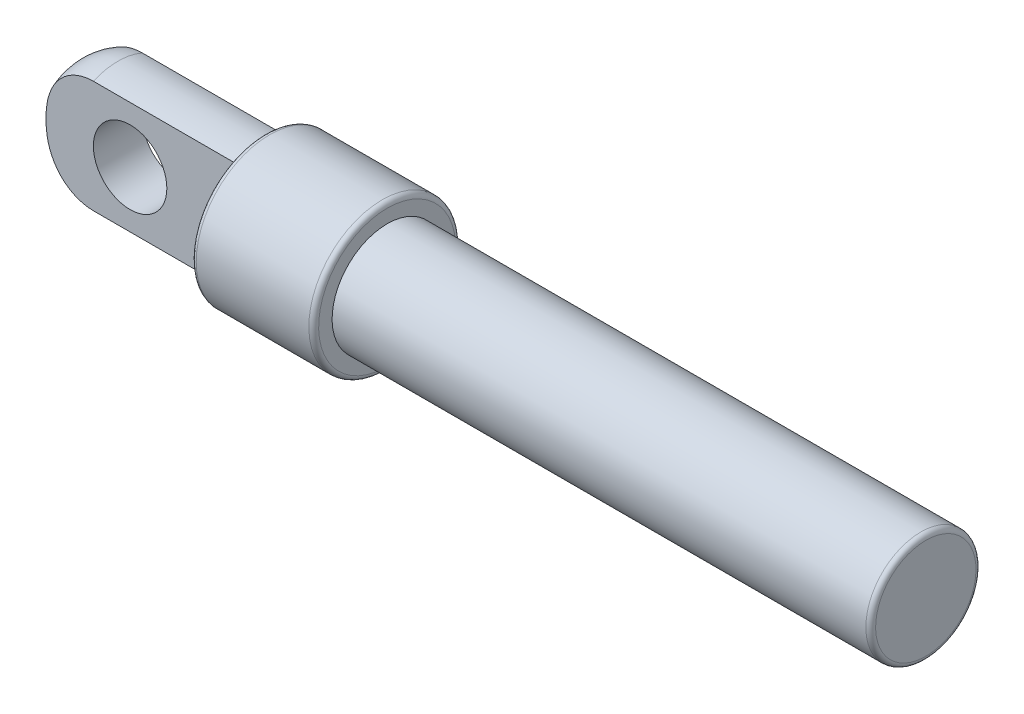
ISO-10303-21;
HEADER;
FILE_DESCRIPTION(('STEP AP214'),'2;1');
FILE_NAME('part.step','',(''),(''),'','','');
FILE_SCHEMA(('AUTOMOTIVE_DESIGN { 1 0 10303 214 1 1 1 1 }'));
ENDSEC;
DATA;
#1=APPLICATION_CONTEXT('core data for automotive mechanical design processes');
#2=APPLICATION_PROTOCOL_DEFINITION('international standard','automotive_design',2000,#1);
#3=PRODUCT_CONTEXT('',#1,'mechanical');
#4=PRODUCT('Part','Part','',(#3));
#5=PRODUCT_RELATED_PRODUCT_CATEGORY('part','',(#4));
#6=PRODUCT_DEFINITION_FORMATION('','',#4);
#7=PRODUCT_DEFINITION_CONTEXT('part definition',#1,'design');
#8=PRODUCT_DEFINITION('design','',#6,#7);
#9=PRODUCT_DEFINITION_SHAPE('','',#8);
#10=(LENGTH_UNIT() NAMED_UNIT(*) SI_UNIT(.MILLI.,.METRE.));
#11=(NAMED_UNIT(*) PLANE_ANGLE_UNIT() SI_UNIT($,.RADIAN.));
#12=(NAMED_UNIT(*) SI_UNIT($,.STERADIAN.) SOLID_ANGLE_UNIT());
#13=UNCERTAINTY_MEASURE_WITH_UNIT(LENGTH_MEASURE(1.E-05),#10,'distance_accuracy_value','');
#14=(GEOMETRIC_REPRESENTATION_CONTEXT(3) GLOBAL_UNCERTAINTY_ASSIGNED_CONTEXT((#13)) GLOBAL_UNIT_ASSIGNED_CONTEXT((#10,
#11,#12)) REPRESENTATION_CONTEXT('',''));
#15=CARTESIAN_POINT('',(0.,0.,0.));
#16=DIRECTION('',(0.,0.,1.));
#17=DIRECTION('',(1.,0.,0.));
#18=AXIS2_PLACEMENT_3D('',#15,#16,#17);
#19=CARTESIAN_POINT('',(0.,0.,0.));
#20=DIRECTION('',(1.,0.,0.));
#21=DIRECTION('',(0.,1.,0.));
#22=AXIS2_PLACEMENT_3D('',#19,#20,#21);
#23=CYLINDRICAL_SURFACE('',#22,2.5);
#24=CARTESIAN_POINT('',(-27.,0.,0.));
#25=DIRECTION('',(1.,0.,0.));
#26=DIRECTION('',(0.,1.,0.));
#27=AXIS2_PLACEMENT_3D('',#24,#25,#26);
#28=CIRCLE('',#27,2.5);
#29=CARTESIAN_POINT('',(-27.,2.29128784747792,-1.));
#30=VERTEX_POINT('',#29);
#31=CARTESIAN_POINT('',(-27.,2.29128784747792,1.));
#32=VERTEX_POINT('',#31);
#33=EDGE_CURVE('E87',#30,#32,#28,.T.);
#34=ORIENTED_EDGE('',*,*,#33,.F.);
#35=DIRECTION('',(1.,0.,0.));
#36=VECTOR('',#35,1.);
#37=CARTESIAN_POINT('',(0.,2.29128784747792,-1.));
#38=LINE('',#37,#36);
#39=CARTESIAN_POINT('',(-33.,2.29128784747792,-1.));
#40=VERTEX_POINT('',#39);
#41=EDGE_CURVE('E96',#30,#40,#38,.F.);
#42=ORIENTED_EDGE('',*,*,#41,.T.);
#43=CARTESIAN_POINT('',(-33.,0.,0.));
#44=DIRECTION('',(-1.,0.,0.));
#45=DIRECTION('',(0.,-1.,0.));
#46=AXIS2_PLACEMENT_3D('',#43,#44,#45);
#47=CIRCLE('',#46,2.5);
#48=CARTESIAN_POINT('',(-33.,2.29128784747792,1.));
#49=VERTEX_POINT('',#48);
#50=EDGE_CURVE('E101',#40,#49,#47,.F.);
#51=ORIENTED_EDGE('',*,*,#50,.T.);
#52=DIRECTION('',(1.,0.,0.));
#53=VECTOR('',#52,1.);
#54=CARTESIAN_POINT('',(0.,2.29128784747792,1.));
#55=LINE('',#54,#53);
#56=EDGE_CURVE('E46',#49,#32,#55,.T.);
#57=ORIENTED_EDGE('',*,*,#56,.T.);
#58=EDGE_LOOP('',(#34,#42,#51,#57));
#59=FACE_BOUND('',#58,.T.);
#60=ADVANCED_FACE('F31',(#59),#23,.T.);
#61=CARTESIAN_POINT('',(-33.,-2.29128784747792,0.999999999999999));
#62=VERTEX_POINT('',#61);
#63=CARTESIAN_POINT('',(-33.,-2.29128784747793,-0.999999999999999));
#64=VERTEX_POINT('',#63);
#65=EDGE_CURVE('E94',#62,#64,#47,.F.);
#66=ORIENTED_EDGE('',*,*,#65,.T.);
#67=DIRECTION('',(1.,0.,0.));
#68=VECTOR('',#67,1.);
#69=CARTESIAN_POINT('',(0.,-2.29128784747792,-0.999999999999999));
#70=LINE('',#69,#68);
#71=CARTESIAN_POINT('',(-27.,-2.29128784747792,-0.999999999999999));
#72=VERTEX_POINT('',#71);
#73=EDGE_CURVE('E54',#64,#72,#70,.T.);
#74=ORIENTED_EDGE('',*,*,#73,.T.);
#75=CARTESIAN_POINT('',(-27.,-2.29128784747792,0.999999999999999));
#76=VERTEX_POINT('',#75);
#77=EDGE_CURVE('E85',#76,#72,#28,.T.);
#78=ORIENTED_EDGE('',*,*,#77,.F.);
#79=DIRECTION('',(1.,0.,0.));
#80=VECTOR('',#79,1.);
#81=CARTESIAN_POINT('',(0.,-2.29128784747792,0.999999999999999));
#82=LINE('',#81,#80);
#83=EDGE_CURVE('E70',#76,#62,#82,.F.);
#84=ORIENTED_EDGE('',*,*,#83,.T.);
#85=EDGE_LOOP('',(#66,#74,#78,#84));
#86=FACE_BOUND('',#85,.T.);
#87=ADVANCED_FACE('F90',(#86),#23,.T.);
#88=CARTESIAN_POINT('',(-33.,0.,0.));
#89=DIRECTION('',(-1.,0.,0.));
#90=DIRECTION('',(0.,-1.,0.));
#91=AXIS2_PLACEMENT_3D('',#88,#89,#90);
#92=DEGENERATE_TOROIDAL_SURFACE('',#91,0.5,2.,.T.);
#93=CARTESIAN_POINT('',(-35.,0.,0.));
#94=DIRECTION('',(-1.,0.,0.));
#95=DIRECTION('',(0.,-1.,0.));
#96=AXIS2_PLACEMENT_3D('',#93,#94,#95);
#97=CIRCLE('',#96,0.5);
#98=CARTESIAN_POINT('',(-35.,-0.500000000000005,0.));
#99=VERTEX_POINT('',#98);
#100=EDGE_CURVE('E102',#99,#99,#97,.T.);
#101=ORIENTED_EDGE('',*,*,#100,.F.);
#102=EDGE_LOOP('',(#101));
#103=FACE_BOUND('',#102,.T.);
#104=ORIENTED_EDGE('',*,*,#50,.F.);
#105=CARTESIAN_POINT('',(-34.9364916731037,0.,-0.999999999999999));
#106=CARTESIAN_POINT('',(-34.9364968852338,-0.0864388218286752,-0.999999999999999));
#107=CARTESIAN_POINT('',(-34.9336508411077,-0.172885243617852,-0.999999999999999));
#108=CARTESIAN_POINT('',(-34.9216730589692,-0.345373113218984,-0.999999999999999));
#109=CARTESIAN_POINT('',(-34.9125406464644,-0.431414516577213,-0.999999999999999));
#110=CARTESIAN_POINT('',(-34.8867385471035,-0.601958148981141,-0.999999999999999));
#111=CARTESIAN_POINT('',(-34.8701076685781,-0.686466001184827,-0.999999999999999));
#112=CARTESIAN_POINT('',(-34.8281780650929,-0.853258846612277,-0.999999999999999));
#113=CARTESIAN_POINT('',(-34.8028862126831,-0.935545546654914,-0.999999999999999));
#114=CARTESIAN_POINT('',(-34.7336554935459,-1.12154296735965,-0.999999999999999));
#115=CARTESIAN_POINT('',(-34.6863725928593,-1.22404586072643,-0.999999999999999));
#116=CARTESIAN_POINT('',(-34.575486457546,-1.41995287957879,-0.999999999999999));
#117=CARTESIAN_POINT('',(-34.5118727611954,-1.51335111938769,-0.999999999999999));
#118=CARTESIAN_POINT('',(-34.3691957111788,-1.6880578175742,-0.999999999999999));
#119=CARTESIAN_POINT('',(-34.2900830598952,-1.76932620182769,-0.999999999999999));
#120=CARTESIAN_POINT('',(-34.1186240688956,-1.91646166331306,-0.999999999999999));
#121=CARTESIAN_POINT('',(-34.026279953278,-1.98233132405443,-0.999999999999999));
#122=CARTESIAN_POINT('',(-33.8365361301393,-2.09314262545748,-0.999999999999999));
#123=CARTESIAN_POINT('',(-33.7396885305735,-2.13903127530775,-0.999999999999999));
#124=CARTESIAN_POINT('',(-33.5395264931629,-2.21337947706467,-0.999999999999999));
#125=CARTESIAN_POINT('',(-33.4362134862595,-2.24184287064474,-0.999999999999999));
#126=CARTESIAN_POINT('',(-33.2290766002669,-2.27987921301313,-0.999999999999999));
#127=CARTESIAN_POINT('',(-33.1253427365699,-2.28994403049808,-0.999999999999999));
#128=CARTESIAN_POINT('',(-32.9176660105233,-2.29237937575555,-0.999999999999999));
#129=CARTESIAN_POINT('',(-32.8137231539911,-2.28475038940861,-0.999999999999999));
#130=CARTESIAN_POINT('',(-32.6093527936423,-2.2521551247641,-0.999999999999999));
#131=CARTESIAN_POINT('',(-32.5089056255521,-2.22731185621842,-0.999999999999999));
#132=CARTESIAN_POINT('',(-32.3135935266958,-2.16119713484256,-0.999999999999999));
#133=CARTESIAN_POINT('',(-32.2187278042196,-2.11992801844631,-0.999999999999999));
#134=CARTESIAN_POINT('',(-32.0367174134781,-2.02199962189955,-0.999999999999999));
#135=CARTESIAN_POINT('',(-31.9496124286416,-1.96526666181699,-0.999999999999999));
#136=CARTESIAN_POINT('',(-31.7858910412443,-1.8382337650407,-0.999999999999999));
#137=CARTESIAN_POINT('',(-31.7092795997144,-1.76792744885991,-0.999999999999999));
#138=CARTESIAN_POINT('',(-31.5668777112779,-1.61426814164631,-0.999999999999999));
#139=CARTESIAN_POINT('',(-31.5013553047682,-1.53066716368665,-0.999999999999999));
#140=CARTESIAN_POINT('',(-31.3845111827147,-1.35429350972309,-0.999999999999999));
#141=CARTESIAN_POINT('',(-31.3331706769844,-1.26153319279847,-0.999999999999999));
#142=CARTESIAN_POINT('',(-31.2423494945351,-1.06380569037484,-0.999999999999999));
#143=CARTESIAN_POINT('',(-31.2037344100404,-0.958442152817419,-0.999999999999999));
#144=CARTESIAN_POINT('',(-31.1571781570387,-0.797066595483357,-0.999999999999999));
#145=CARTESIAN_POINT('',(-31.1435373991847,-0.742603281261979,-0.999999999999999));
#146=CARTESIAN_POINT('',(-31.1197963740074,-0.632905260704804,-0.999999999999999));
#147=CARTESIAN_POINT('',(-31.1096962986549,-0.577670512711706,-0.999999999999999));
#148=CARTESIAN_POINT('',(-31.0861217907918,-0.423770035022283,-0.999999999999999));
#149=CARTESIAN_POINT('',(-31.0760841446268,-0.324571078041406,-0.999999999999999));
#150=CARTESIAN_POINT('',(-31.0671739958668,-0.17541607996462,-0.999999999999999));
#151=CARTESIAN_POINT('',(-31.0652292021336,-0.125600131528569,-0.999999999999999));
#152=CARTESIAN_POINT('',(-31.0632719423356,-0.0259266605596096,-0.999999999999999));
#153=CARTESIAN_POINT('',(-31.0632593969476,0.0239308601826358,-0.999999999999999));
#154=CARTESIAN_POINT('',(-31.0651637573037,0.123568152603971,-0.999999999999999));
#155=CARTESIAN_POINT('',(-31.0670790338137,0.173347954385343,-0.999999999999999));
#156=CARTESIAN_POINT('',(-31.0729631654939,0.272785837877402,-0.999999999999999));
#157=CARTESIAN_POINT('',(-31.07693224011,0.322443906011211,-0.999999999999999));
#158=CARTESIAN_POINT('',(-31.0922413160979,0.470945840551915,-0.999999999999999));
#159=CARTESIAN_POINT('',(-31.1069851136435,0.569492965794004,-0.999999999999999));
#160=CARTESIAN_POINT('',(-31.1394997491128,0.725846049388304,-0.999999999999999));
#161=CARTESIAN_POINT('',(-31.153781731779,0.784387214364913,-0.999999999999999));
#162=CARTESIAN_POINT('',(-31.1867198047101,0.900242013623902,-0.999999999999999));
#163=CARTESIAN_POINT('',(-31.205375994409,0.957555619969231,-0.999999999999999));
#164=CARTESIAN_POINT('',(-31.2472174326082,1.07033514303808,-0.999999999999999));
#165=CARTESIAN_POINT('',(-31.2703898556246,1.12580578324702,-0.999999999999999));
#166=CARTESIAN_POINT('',(-31.3213669072587,1.23457989257109,-0.999999999999999));
#167=CARTESIAN_POINT('',(-31.349172804357,1.28788276324306,-0.999999999999999));
#168=CARTESIAN_POINT('',(-31.4399710243922,1.44453212847917,-0.999999999999999));
#169=CARTESIAN_POINT('',(-31.5100817128507,1.54389716469059,-0.999999999999999));
#170=CARTESIAN_POINT('',(-31.6677283124245,1.72788292215399,-0.999999999999999));
#171=CARTESIAN_POINT('',(-31.7552840021361,1.8124867014528,-0.999999999999999));
#172=CARTESIAN_POINT('',(-31.9359159469969,1.95612504152074,-0.999999999999999));
#173=CARTESIAN_POINT('',(-32.0276661538203,2.01682998385321,-1.));
#174=CARTESIAN_POINT('',(-32.2203720744706,2.12110029618652,-1.));
#175=CARTESIAN_POINT('',(-32.3213204024383,2.16467927108066,-1.));
#176=CARTESIAN_POINT('',(-32.5247062401465,2.23170899244727,-1.));
#177=CARTESIAN_POINT('',(-32.6268780947665,2.25596834614888,-1.));
#178=CARTESIAN_POINT('',(-32.8338719061735,2.28673772584853,-1.));
#179=CARTESIAN_POINT('',(-32.9386939101885,2.29324743530671,-1.));
#180=CARTESIAN_POINT('',(-33.1465088529826,2.28833829160632,-1.));
#181=CARTESIAN_POINT('',(-33.2495075227132,2.27715772394052,-1.));
#182=CARTESIAN_POINT('',(-33.4521566843987,2.23766480667797,-1.));
#183=CARTESIAN_POINT('',(-33.5518074290321,2.20935375305316,-1.));
#184=CARTESIAN_POINT('',(-33.7450007648209,2.13647083978637,-1.));
#185=CARTESIAN_POINT('',(-33.8385415126327,2.09189409937022,-0.999999999999999));
#186=CARTESIAN_POINT('',(-34.0169401464301,1.98786230607881,-0.999999999999999));
#187=CARTESIAN_POINT('',(-34.101797497825,1.92840633794365,-0.999999999999999));
#188=CARTESIAN_POINT('',(-34.2617187190869,1.79555320930827,-0.999999999999999));
#189=CARTESIAN_POINT('',(-34.3366357572135,1.72197954236864,-0.999999999999999));
#190=CARTESIAN_POINT('',(-34.4735725647619,1.56371487942677,-0.999999999999999));
#191=CARTESIAN_POINT('',(-34.5355923454226,1.47902389311247,-0.999999999999999));
#192=CARTESIAN_POINT('',(-34.6478643283935,1.29756162306096,-0.999999999999999));
#193=CARTESIAN_POINT('',(-34.6975575098147,1.20044613856425,-0.999999999999999));
#194=CARTESIAN_POINT('',(-34.7817127912752,0.999932461553226,-0.999999999999999));
#195=CARTESIAN_POINT('',(-34.816180247701,0.896536493087977,-0.999999999999999));
#196=CARTESIAN_POINT('',(-34.860409647958,0.727105785540783,-0.999999999999999));
#197=CARTESIAN_POINT('',(-34.8745675671338,0.662159208612286,-0.999999999999999));
#198=CARTESIAN_POINT('',(-34.8981712395961,0.531403966585108,-0.999999999999999));
#199=CARTESIAN_POINT('',(-34.9076160789197,0.465595136815183,-0.999999999999999));
#200=CARTESIAN_POINT('',(-34.9224122632784,0.333254708198169,-0.999999999999999));
#201=CARTESIAN_POINT('',(-34.9277462307139,0.266721233843884,-0.999999999999999));
#202=CARTESIAN_POINT('',(-34.9347842452125,0.133460037756156,-0.999999999999999));
#203=CARTESIAN_POINT('',(-34.936487649248,0.0667322837082231,-0.999999999999999));
#204=CARTESIAN_POINT('',(-34.9364916731037,0.,-0.999999999999999));
#205=B_SPLINE_CURVE_WITH_KNOTS('',3,(#105,#106,#107,#108,#109,#110,#111,#112,#113,#114,#115,
#116,#117,#118,#119,#120,#121,#122,#123,#124,#125,#126,#127,#128,#129,#130,#131,#132,#133,#134,
#135,#136,#137,#138,#139,#140,#141,#142,#143,#144,#145,#146,#147,#148,#149,#150,#151,#152,#153,
#154,#155,#156,#157,#158,#159,#160,#161,#162,#163,#164,#165,#166,#167,#168,#169,#170,#171,#172,
#173,#174,#175,#176,#177,#178,#179,#180,#181,#182,#183,#184,#185,#186,#187,#188,#189,#190,#191,
#192,#193,#194,#195,#196,#197,#198,#199,#200,#201,#202,#203,#204),.UNSPECIFIED.,.T.,.F.,(4,2,2,
2,2,2,2,2,2,2,2,2,2,2,2,2,2,2,2,2,2,2,2,2,2,2,2,2,2,2,2,2,2,2,2,2,2,2,2,2,2,2,2,2,2,2,2,2,2,4),
(0.,0.259274933937938,0.518577690974417,0.776553562582868,1.03432520086806,1.3714938519556,
1.7088790390928,2.04735530179383,2.38577473606898,2.70569903793162,3.02555278199602,
3.33672297400177,3.64788462122253,3.95684539664001,4.26576224077239,4.57617750451679,
4.88673902040676,5.20397706706405,5.52079275354719,5.8560728197869,6.02441247245902,
6.19276125086521,6.49138212898077,6.64092119483676,6.79045412178008,6.93986078198001,
7.08928340939348,7.38760364150585,7.56823436609465,7.74886919715895,7.92899833432591,
8.10917686570964,8.47180749653331,8.83485163041563,9.16322007919573,9.4913271417323,
9.80484962483818,10.1183776991386,10.4277184190889,10.737035739424,11.0464459516959,
11.3558752012726,11.6694600855627,11.9830446965881,12.3089676162012,12.634775785142,
12.8340286071411,13.0333200533483,13.2334493984104,13.4336141864529),.UNSPECIFIED.);
#206=EDGE_CURVE('E110',#40,#64,#205,.T.);
#207=ORIENTED_EDGE('',*,*,#206,.T.);
#208=ORIENTED_EDGE('',*,*,#65,.F.);
#209=CARTESIAN_POINT('',(-34.9364916731037,0.,0.999999999999999));
#210=CARTESIAN_POINT('',(-34.9364968852338,0.0864388218286675,0.999999999999999));
#211=CARTESIAN_POINT('',(-34.9336508411077,0.172885243617845,0.999999999999999));
#212=CARTESIAN_POINT('',(-34.9216730589692,0.345373113218976,0.999999999999999));
#213=CARTESIAN_POINT('',(-34.9125406464644,0.431414516577206,0.999999999999999));
#214=CARTESIAN_POINT('',(-34.8867385471035,0.601958148981133,0.999999999999999));
#215=CARTESIAN_POINT('',(-34.8701076685781,0.686466001184819,0.999999999999999));
#216=CARTESIAN_POINT('',(-34.8281780650929,0.853258846612269,0.999999999999999));
#217=CARTESIAN_POINT('',(-34.8028862126831,0.935545546654906,0.999999999999999));
#218=CARTESIAN_POINT('',(-34.7336554935459,1.12154296735964,0.999999999999999));
#219=CARTESIAN_POINT('',(-34.6863725928593,1.22404586072643,0.999999999999999));
#220=CARTESIAN_POINT('',(-34.575486457546,1.41995287957878,0.999999999999999));
#221=CARTESIAN_POINT('',(-34.5118727611954,1.51335111938768,0.999999999999999));
#222=CARTESIAN_POINT('',(-34.3691957111788,1.68805781757419,0.999999999999999));
#223=CARTESIAN_POINT('',(-34.2900830598952,1.76932620182768,0.999999999999999));
#224=CARTESIAN_POINT('',(-34.1186240688956,1.91646166331305,0.999999999999999));
#225=CARTESIAN_POINT('',(-34.026279953278,1.98233132405443,0.999999999999999));
#226=CARTESIAN_POINT('',(-33.8365361301393,2.09314262545747,0.999999999999999));
#227=CARTESIAN_POINT('',(-33.7396885305735,2.13903127530775,1.));
#228=CARTESIAN_POINT('',(-33.5395264931629,2.21337947706466,1.));
#229=CARTESIAN_POINT('',(-33.4362134862595,2.24184287064473,1.));
#230=CARTESIAN_POINT('',(-33.2290766002669,2.27987921301313,1.));
#231=CARTESIAN_POINT('',(-33.1253427365699,2.28994403049807,1.));
#232=CARTESIAN_POINT('',(-32.9176660105233,2.29237937575554,1.));
#233=CARTESIAN_POINT('',(-32.8137231539911,2.28475038940861,1.));
#234=CARTESIAN_POINT('',(-32.6093527936423,2.25215512476409,1.));
#235=CARTESIAN_POINT('',(-32.5089056255521,2.22731185621841,1.));
#236=CARTESIAN_POINT('',(-32.3135935266958,2.16119713484255,1.));
#237=CARTESIAN_POINT('',(-32.2187278042196,2.1199280184463,1.));
#238=CARTESIAN_POINT('',(-32.0367174134781,2.02199962189954,1.));
#239=CARTESIAN_POINT('',(-31.9496124286416,1.96526666181698,0.999999999999999));
#240=CARTESIAN_POINT('',(-31.7858910412443,1.83823376504069,0.999999999999999));
#241=CARTESIAN_POINT('',(-31.7092795997144,1.7679274488599,0.999999999999999));
#242=CARTESIAN_POINT('',(-31.5668777112779,1.6142681416463,0.999999999999999));
#243=CARTESIAN_POINT('',(-31.5013553047682,1.53066716368664,0.999999999999999));
#244=CARTESIAN_POINT('',(-31.3845111827147,1.35429350972308,0.999999999999999));
#245=CARTESIAN_POINT('',(-31.3331706769844,1.26153319279846,0.999999999999999));
#246=CARTESIAN_POINT('',(-31.2423494945351,1.06380569037483,0.999999999999999));
#247=CARTESIAN_POINT('',(-31.2037344100404,0.95844215281741,0.999999999999999));
#248=CARTESIAN_POINT('',(-31.1571781570387,0.797066595483348,0.999999999999999));
#249=CARTESIAN_POINT('',(-31.1435373991847,0.74260328126197,0.999999999999999));
#250=CARTESIAN_POINT('',(-31.1197963740074,0.632905260704795,0.999999999999999));
#251=CARTESIAN_POINT('',(-31.1096962986549,0.577670512711697,0.999999999999999));
#252=CARTESIAN_POINT('',(-31.0861217907918,0.423770035022274,0.999999999999999));
#253=CARTESIAN_POINT('',(-31.0760841446268,0.324571078041397,0.999999999999999));
#254=CARTESIAN_POINT('',(-31.0671739958668,0.17541607996461,0.999999999999999));
#255=CARTESIAN_POINT('',(-31.0652292021336,0.125600131528559,0.999999999999999));
#256=CARTESIAN_POINT('',(-31.0632719423356,0.0259266605595997,0.999999999999999));
#257=CARTESIAN_POINT('',(-31.0632593969476,-0.0239308601826454,0.999999999999999));
#258=CARTESIAN_POINT('',(-31.0651637573037,-0.123568152603981,0.999999999999999));
#259=CARTESIAN_POINT('',(-31.0670790338137,-0.173347954385352,0.999999999999999));
#260=CARTESIAN_POINT('',(-31.0729631654939,-0.272785837877411,0.999999999999999));
#261=CARTESIAN_POINT('',(-31.07693224011,-0.32244390601122,0.999999999999999));
#262=CARTESIAN_POINT('',(-31.0922413160979,-0.470945840551925,0.999999999999999));
#263=CARTESIAN_POINT('',(-31.1069851136435,-0.569492965794014,0.999999999999999));
#264=CARTESIAN_POINT('',(-31.1394997491128,-0.725846049388315,0.999999999999999));
#265=CARTESIAN_POINT('',(-31.153781731779,-0.784387214364923,0.999999999999999));
#266=CARTESIAN_POINT('',(-31.1867198047101,-0.900242013623913,0.999999999999999));
#267=CARTESIAN_POINT('',(-31.205375994409,-0.957555619969242,0.999999999999999));
#268=CARTESIAN_POINT('',(-31.2472174326082,-1.07033514303809,0.999999999999999));
#269=CARTESIAN_POINT('',(-31.2703898556246,-1.12580578324703,0.999999999999999));
#270=CARTESIAN_POINT('',(-31.3213669072587,-1.2345798925711,0.999999999999999));
#271=CARTESIAN_POINT('',(-31.349172804357,-1.28788276324307,0.999999999999999));
#272=CARTESIAN_POINT('',(-31.4399710243922,-1.44453212847919,0.999999999999999));
#273=CARTESIAN_POINT('',(-31.5100817128507,-1.54389716469061,0.999999999999999));
#274=CARTESIAN_POINT('',(-31.6677283124245,-1.727882922154,0.999999999999999));
#275=CARTESIAN_POINT('',(-31.7552840021361,-1.81248670145281,0.999999999999999));
#276=CARTESIAN_POINT('',(-31.9359159469969,-1.95612504152075,0.999999999999999));
#277=CARTESIAN_POINT('',(-32.0276661538203,-2.01682998385322,0.999999999999999));
#278=CARTESIAN_POINT('',(-32.2203720744706,-2.12110029618653,0.999999999999999));
#279=CARTESIAN_POINT('',(-32.3213204024383,-2.16467927108067,0.999999999999999));
#280=CARTESIAN_POINT('',(-32.5247062401465,-2.23170899244727,0.999999999999999));
#281=CARTESIAN_POINT('',(-32.6268780947665,-2.25596834614889,0.999999999999999));
#282=CARTESIAN_POINT('',(-32.8338719061735,-2.28673772584854,0.999999999999999));
#283=CARTESIAN_POINT('',(-32.9386939101885,-2.29324743530672,0.999999999999999));
#284=CARTESIAN_POINT('',(-33.1465088529826,-2.28833829160633,0.999999999999999));
#285=CARTESIAN_POINT('',(-33.2495075227132,-2.27715772394053,0.999999999999999));
#286=CARTESIAN_POINT('',(-33.4521566843987,-2.23766480667798,0.999999999999999));
#287=CARTESIAN_POINT('',(-33.5518074290321,-2.20935375305317,0.999999999999999));
#288=CARTESIAN_POINT('',(-33.7450007648209,-2.13647083978638,0.999999999999999));
#289=CARTESIAN_POINT('',(-33.8385415126326,-2.09189409937023,0.999999999999999));
#290=CARTESIAN_POINT('',(-34.0169401464301,-1.98786230607882,0.999999999999999));
#291=CARTESIAN_POINT('',(-34.101797497825,-1.92840633794366,0.999999999999999));
#292=CARTESIAN_POINT('',(-34.2617187190869,-1.79555320930827,0.999999999999999));
#293=CARTESIAN_POINT('',(-34.3366357572135,-1.72197954236864,0.999999999999999));
#294=CARTESIAN_POINT('',(-34.4735725647619,-1.56371487942677,0.999999999999999));
#295=CARTESIAN_POINT('',(-34.5355923454226,-1.47902389311247,0.999999999999999));
#296=CARTESIAN_POINT('',(-34.6478643283935,-1.29756162306097,0.999999999999999));
#297=CARTESIAN_POINT('',(-34.6975575098147,-1.20044613856426,0.999999999999999));
#298=CARTESIAN_POINT('',(-34.7817127912752,-0.999932461553232,0.999999999999999));
#299=CARTESIAN_POINT('',(-34.816180247701,-0.896536493087982,0.999999999999999));
#300=CARTESIAN_POINT('',(-34.860409647958,-0.727105785540788,0.999999999999999));
#301=CARTESIAN_POINT('',(-34.8745675671338,-0.662159208612291,0.999999999999999));
#302=CARTESIAN_POINT('',(-34.8981712395961,-0.531403966585114,0.999999999999999));
#303=CARTESIAN_POINT('',(-34.9076160789197,-0.465595136815189,0.999999999999999));
#304=CARTESIAN_POINT('',(-34.9224122632784,-0.333254708198175,0.999999999999999));
#305=CARTESIAN_POINT('',(-34.9277462307139,-0.266721233843891,0.999999999999999));
#306=CARTESIAN_POINT('',(-34.9347842452125,-0.133460037756163,0.999999999999999));
#307=CARTESIAN_POINT('',(-34.936487649248,-0.0667322837082304,0.999999999999999));
#308=CARTESIAN_POINT('',(-34.9364916731037,0.,0.999999999999999));
#309=B_SPLINE_CURVE_WITH_KNOTS('',3,(#209,#210,#211,#212,#213,#214,#215,#216,#217,#218,#219,
#220,#221,#222,#223,#224,#225,#226,#227,#228,#229,#230,#231,#232,#233,#234,#235,#236,#237,#238,
#239,#240,#241,#242,#243,#244,#245,#246,#247,#248,#249,#250,#251,#252,#253,#254,#255,#256,#257,
#258,#259,#260,#261,#262,#263,#264,#265,#266,#267,#268,#269,#270,#271,#272,#273,#274,#275,#276,
#277,#278,#279,#280,#281,#282,#283,#284,#285,#286,#287,#288,#289,#290,#291,#292,#293,#294,#295,
#296,#297,#298,#299,#300,#301,#302,#303,#304,#305,#306,#307,#308),.UNSPECIFIED.,.T.,.F.,(4,2,2,
2,2,2,2,2,2,2,2,2,2,2,2,2,2,2,2,2,2,2,2,2,2,2,2,2,2,2,2,2,2,2,2,2,2,2,2,2,2,2,2,2,2,2,2,2,2,4),
(0.,0.259274933937938,0.518577690974417,0.776553562582868,1.03432520086806,1.3714938519556,
1.7088790390928,2.04735530179383,2.38577473606898,2.70569903793162,3.02555278199601,
3.33672297400177,3.64788462122254,3.95684539664001,4.26576224077239,4.57617750451678,
4.88673902040676,5.20397706706405,5.52079275354719,5.8560728197869,6.02441247245902,
6.19276125086521,6.49138212898077,6.64092119483676,6.79045412178008,6.93986078198001,
7.08928340939348,7.38760364150585,7.56823436609466,7.74886919715895,7.92899833432592,
8.10917686570964,8.47180749653332,8.83485163041564,9.16322007919575,9.4913271417323,
9.80484962483818,10.1183776991386,10.4277184190889,10.737035739424,11.0464459516959,
11.3558752012726,11.6694600855627,11.9830446965881,12.3089676162012,12.634775785142,
12.8340286071411,13.0333200533483,13.2334493984104,13.4336141864529),.UNSPECIFIED.);
#310=EDGE_CURVE('E74',#62,#49,#309,.T.);
#311=ORIENTED_EDGE('',*,*,#310,.T.);
#312=EDGE_LOOP('',(#104,#207,#208,#311));
#313=FACE_BOUND('',#312,.T.);
#314=ADVANCED_FACE('F115',(#103,#313),#92,.T.);
#315=CARTESIAN_POINT('',(0.,0.,0.));
#316=DIRECTION('',(1.,0.,0.));
#317=DIRECTION('',(0.,1.,0.));
#318=AXIS2_PLACEMENT_3D('',#315,#316,#317);
#319=PLANE('',#318);
#320=CARTESIAN_POINT('',(0.,0.,0.));
#321=DIRECTION('',(1.,0.,0.));
#322=DIRECTION('',(0.,1.,0.));
#323=AXIS2_PLACEMENT_3D('',#320,#321,#322);
#324=CIRCLE('',#323,2.05);
#325=CARTESIAN_POINT('',(0.,2.05,0.));
#326=VERTEX_POINT('',#325);
#327=EDGE_CURVE('E39',#326,#326,#324,.T.);
#328=ORIENTED_EDGE('',*,*,#327,.T.);
#329=EDGE_LOOP('',(#328));
#330=FACE_BOUND('',#329,.T.);
#331=ADVANCED_FACE('F149',(#330),#319,.T.);
#332=CARTESIAN_POINT('',(0.,0.,0.));
#333=DIRECTION('',(1.,0.,0.));
#334=DIRECTION('',(0.,1.,0.));
#335=AXIS2_PLACEMENT_3D('',#332,#333,#334);
#336=CYLINDRICAL_SURFACE('',#335,2.25);
#337=CARTESIAN_POINT('',(-0.2,0.,0.));
#338=DIRECTION('',(1.,0.,0.));
#339=DIRECTION('',(0.,1.,0.));
#340=AXIS2_PLACEMENT_3D('',#337,#338,#339);
#341=CIRCLE('',#340,2.25);
#342=CARTESIAN_POINT('',(-0.2,2.25,0.));
#343=VERTEX_POINT('',#342);
#344=EDGE_CURVE('E11',#343,#343,#341,.F.);
#345=ORIENTED_EDGE('',*,*,#344,.T.);
#346=EDGE_LOOP('',(#345));
#347=FACE_BOUND('',#346,.T.);
#348=CARTESIAN_POINT('',(-22.,0.,0.));
#349=DIRECTION('',(1.,0.,0.));
#350=DIRECTION('',(0.,1.,0.));
#351=AXIS2_PLACEMENT_3D('',#348,#349,#350);
#352=CIRCLE('',#351,2.25);
#353=CARTESIAN_POINT('',(-22.,2.25,0.));
#354=VERTEX_POINT('',#353);
#355=EDGE_CURVE('E91',#354,#354,#352,.T.);
#356=ORIENTED_EDGE('',*,*,#355,.T.);
#357=EDGE_LOOP('',(#356));
#358=FACE_BOUND('',#357,.T.);
#359=ADVANCED_FACE('F146',(#347,#358),#336,.T.);
#360=CARTESIAN_POINT('',(-22.,2.25,0.));
#361=DIRECTION('',(1.,0.,0.));
#362=DIRECTION('',(0.,1.,0.));
#363=AXIS2_PLACEMENT_3D('',#360,#361,#362);
#364=PLANE('',#363);
#365=CARTESIAN_POINT('',(-22.,0.,0.));
#366=DIRECTION('',(1.,0.,0.));
#367=DIRECTION('',(0.,1.,0.));
#368=AXIS2_PLACEMENT_3D('',#365,#366,#367);
#369=CIRCLE('',#368,2.8);
#370=CARTESIAN_POINT('',(-22.,2.8,0.));
#371=VERTEX_POINT('',#370);
#372=EDGE_CURVE('E169',#371,#371,#369,.T.);
#373=ORIENTED_EDGE('',*,*,#372,.T.);
#374=EDGE_LOOP('',(#373));
#375=FACE_BOUND('',#374,.T.);
#376=ORIENTED_EDGE('',*,*,#355,.F.);
#377=EDGE_LOOP('',(#376));
#378=FACE_BOUND('',#377,.T.);
#379=ADVANCED_FACE('F142',(#375,#378),#364,.T.);
#380=CARTESIAN_POINT('',(0.,0.,0.));
#381=DIRECTION('',(1.,0.,0.));
#382=DIRECTION('',(0.,1.,0.));
#383=AXIS2_PLACEMENT_3D('',#380,#381,#382);
#384=CYLINDRICAL_SURFACE('',#383,3.);
#385=CARTESIAN_POINT('',(-22.2,0.,0.));
#386=DIRECTION('',(1.,0.,0.));
#387=DIRECTION('',(0.,1.,0.));
#388=AXIS2_PLACEMENT_3D('',#385,#386,#387);
#389=CIRCLE('',#388,3.);
#390=CARTESIAN_POINT('',(-22.2,3.,0.));
#391=VERTEX_POINT('',#390);
#392=EDGE_CURVE('E162',#391,#391,#389,.F.);
#393=ORIENTED_EDGE('',*,*,#392,.T.);
#394=EDGE_LOOP('',(#393));
#395=FACE_BOUND('',#394,.T.);
#396=CARTESIAN_POINT('',(-26.8,0.,0.));
#397=DIRECTION('',(-1.,0.,0.));
#398=DIRECTION('',(0.,-1.,0.));
#399=AXIS2_PLACEMENT_3D('',#396,#397,#398);
#400=CIRCLE('',#399,3.);
#401=CARTESIAN_POINT('',(-26.8,-3.,0.));
#402=VERTEX_POINT('',#401);
#403=EDGE_CURVE('E167',#402,#402,#400,.F.);
#404=ORIENTED_EDGE('',*,*,#403,.T.);
#405=EDGE_LOOP('',(#404));
#406=FACE_BOUND('',#405,.T.);
#407=ADVANCED_FACE('F138',(#395,#406),#384,.T.);
#408=CARTESIAN_POINT('',(-27.,3.,0.));
#409=DIRECTION('',(-1.,0.,0.));
#410=DIRECTION('',(0.,-1.,0.));
#411=AXIS2_PLACEMENT_3D('',#408,#409,#410);
#412=PLANE('',#411);
#413=CARTESIAN_POINT('',(-27.,0.,0.));
#414=DIRECTION('',(-1.,0.,0.));
#415=DIRECTION('',(0.,-1.,0.));
#416=AXIS2_PLACEMENT_3D('',#413,#414,#415);
#417=CIRCLE('',#416,2.8);
#418=CARTESIAN_POINT('',(-27.,-2.8,0.));
#419=VERTEX_POINT('',#418);
#420=EDGE_CURVE('E160',#419,#419,#417,.T.);
#421=ORIENTED_EDGE('',*,*,#420,.T.);
#422=EDGE_LOOP('',(#421));
#423=FACE_BOUND('',#422,.T.);
#424=DIRECTION('',(0.,-1.,0.));
#425=VECTOR('',#424,1.);
#426=CARTESIAN_POINT('',(-27.,5.80282483069247,-1.));
#427=LINE('',#426,#425);
#428=EDGE_CURVE('E88',#30,#72,#427,.T.);
#429=ORIENTED_EDGE('',*,*,#428,.F.);
#430=ORIENTED_EDGE('',*,*,#33,.T.);
#431=DIRECTION('',(0.,1.,0.));
#432=VECTOR('',#431,1.);
#433=CARTESIAN_POINT('',(-27.,5.80282483069247,1.));
#434=LINE('',#433,#432);
#435=EDGE_CURVE('E73',#76,#32,#434,.T.);
#436=ORIENTED_EDGE('',*,*,#435,.F.);
#437=ORIENTED_EDGE('',*,*,#77,.T.);
#438=EDGE_LOOP('',(#429,#430,#436,#437));
#439=FACE_BOUND('',#438,.T.);
#440=ADVANCED_FACE('F84',(#423,#439),#412,.T.);
#441=CARTESIAN_POINT('',(-35.,2.5,0.));
#442=DIRECTION('',(-1.,0.,0.));
#443=DIRECTION('',(0.,-1.,0.));
#444=AXIS2_PLACEMENT_3D('',#441,#442,#443);
#445=PLANE('',#444);
#446=ORIENTED_EDGE('',*,*,#100,.T.);
#447=EDGE_LOOP('',(#446));
#448=FACE_BOUND('',#447,.T.);
#449=ADVANCED_FACE('F123',(#448),#445,.T.);
#450=CARTESIAN_POINT('',(-27.,5.80282483069247,1.));
#451=DIRECTION('',(0.,0.,1.));
#452=DIRECTION('',(0.,-1.,0.));
#453=AXIS2_PLACEMENT_3D('',#450,#451,#452);
#454=PLANE('',#453);
#455=CARTESIAN_POINT('',(-31.5,0.,0.999999999999999));
#456=DIRECTION('',(0.,0.,1.));
#457=DIRECTION('',(0.,-1.,0.));
#458=AXIS2_PLACEMENT_3D('',#455,#456,#457);
#459=CIRCLE('',#458,1.50000000000001);
#460=CARTESIAN_POINT('',(-31.5,-1.50000000000001,0.999999999999999));
#461=VERTEX_POINT('',#460);
#462=EDGE_CURVE('E179',#461,#461,#459,.F.);
#463=ORIENTED_EDGE('',*,*,#462,.T.);
#464=EDGE_LOOP('',(#463));
#465=FACE_BOUND('',#464,.T.);
#466=ORIENTED_EDGE('',*,*,#435,.T.);
#467=ORIENTED_EDGE('',*,*,#56,.F.);
#468=ORIENTED_EDGE('',*,*,#310,.F.);
#469=ORIENTED_EDGE('',*,*,#83,.F.);
#470=EDGE_LOOP('',(#466,#467,#468,#469));
#471=FACE_BOUND('',#470,.T.);
#472=ADVANCED_FACE('F72',(#465,#471),#454,.T.);
#473=CARTESIAN_POINT('',(-27.,5.80282483069247,-1.));
#474=DIRECTION('',(0.,0.,-1.));
#475=DIRECTION('',(0.,1.,0.));
#476=AXIS2_PLACEMENT_3D('',#473,#474,#475);
#477=PLANE('',#476);
#478=CARTESIAN_POINT('',(-31.5,0.,-0.999999999999999));
#479=DIRECTION('',(0.,0.,-1.));
#480=DIRECTION('',(0.,1.,0.));
#481=AXIS2_PLACEMENT_3D('',#478,#479,#480);
#482=CIRCLE('',#481,1.50000000000001);
#483=CARTESIAN_POINT('',(-31.5,1.50000000000001,-0.999999999999999));
#484=VERTEX_POINT('',#483);
#485=EDGE_CURVE('E182',#484,#484,#482,.T.);
#486=ORIENTED_EDGE('',*,*,#485,.F.);
#487=EDGE_LOOP('',(#486));
#488=FACE_BOUND('',#487,.T.);
#489=ORIENTED_EDGE('',*,*,#428,.T.);
#490=ORIENTED_EDGE('',*,*,#73,.F.);
#491=ORIENTED_EDGE('',*,*,#206,.F.);
#492=ORIENTED_EDGE('',*,*,#41,.F.);
#493=EDGE_LOOP('',(#489,#490,#491,#492));
#494=FACE_BOUND('',#493,.T.);
#495=ADVANCED_FACE('F122',(#488,#494),#477,.T.);
#496=CARTESIAN_POINT('',(-31.5,0.,5.24264068711931));
#497=DIRECTION('',(0.,0.,-1.));
#498=DIRECTION('',(0.,1.,0.));
#499=AXIS2_PLACEMENT_3D('',#496,#497,#498);
#500=CYLINDRICAL_SURFACE('',#499,1.50000000000001);
#501=ORIENTED_EDGE('',*,*,#485,.T.);
#502=EDGE_LOOP('',(#501));
#503=FACE_BOUND('',#502,.T.);
#504=ORIENTED_EDGE('',*,*,#462,.F.);
#505=EDGE_LOOP('',(#504));
#506=FACE_BOUND('',#505,.T.);
#507=ADVANCED_FACE('F125',(#503,#506),#500,.F.);
#508=CARTESIAN_POINT('',(-22.2,0.,0.));
#509=DIRECTION('',(1.,0.,0.));
#510=DIRECTION('',(0.,1.,0.));
#511=AXIS2_PLACEMENT_3D('',#508,#509,#510);
#512=TOROIDAL_SURFACE('',#511,2.8,0.2);
#513=ORIENTED_EDGE('',*,*,#392,.F.);
#514=EDGE_LOOP('',(#513));
#515=FACE_BOUND('',#514,.T.);
#516=ORIENTED_EDGE('',*,*,#372,.F.);
#517=EDGE_LOOP('',(#516));
#518=FACE_BOUND('',#517,.T.);
#519=ADVANCED_FACE('F188',(#515,#518),#512,.T.);
#520=CARTESIAN_POINT('',(-26.8,0.,0.));
#521=DIRECTION('',(-1.,0.,0.));
#522=DIRECTION('',(0.,-1.,0.));
#523=AXIS2_PLACEMENT_3D('',#520,#521,#522);
#524=TOROIDAL_SURFACE('',#523,2.8,0.2);
#525=ORIENTED_EDGE('',*,*,#420,.F.);
#526=EDGE_LOOP('',(#525));
#527=FACE_BOUND('',#526,.T.);
#528=ORIENTED_EDGE('',*,*,#403,.F.);
#529=EDGE_LOOP('',(#528));
#530=FACE_BOUND('',#529,.T.);
#531=ADVANCED_FACE('F193',(#527,#530),#524,.T.);
#532=CARTESIAN_POINT('',(-0.2,0.,0.));
#533=DIRECTION('',(1.,0.,0.));
#534=DIRECTION('',(0.,1.,0.));
#535=AXIS2_PLACEMENT_3D('',#532,#533,#534);
#536=TOROIDAL_SURFACE('',#535,2.05,0.2);
#537=ORIENTED_EDGE('',*,*,#344,.F.);
#538=EDGE_LOOP('',(#537));
#539=FACE_BOUND('',#538,.T.);
#540=ORIENTED_EDGE('',*,*,#327,.F.);
#541=EDGE_LOOP('',(#540));
#542=FACE_BOUND('',#541,.T.);
#543=ADVANCED_FACE('F33',(#539,#542),#536,.T.);
#544=CLOSED_SHELL('',(#60,#87,#314,#331,#359,#379,#407,#440,#449,#472,#495,#507,#519,#531,#543));
#545=MANIFOLD_SOLID_BREP('B2',#544);
#546=ADVANCED_BREP_SHAPE_REPRESENTATION('',(#18,#545),#14);
#547=SHAPE_DEFINITION_REPRESENTATION(#9,#546);
ENDSEC;
END-ISO-10303-21;
